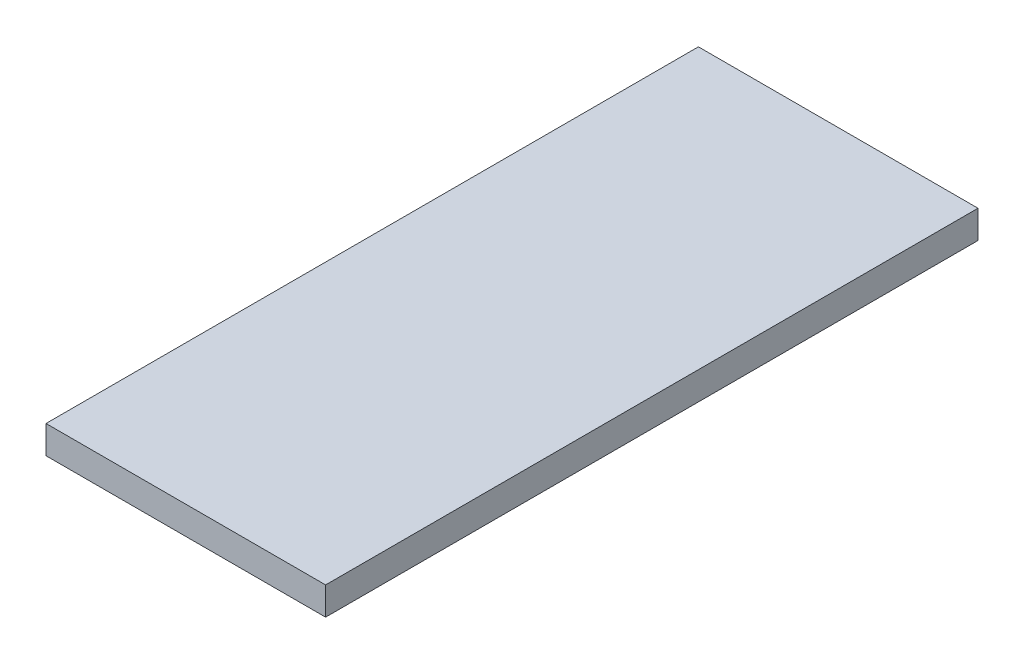
ISO-10303-21;
HEADER;
FILE_DESCRIPTION(('STEP AP214'),'2;1');
FILE_NAME('part.step','',(''),(''),'','','');
FILE_SCHEMA(('AUTOMOTIVE_DESIGN { 1 0 10303 214 1 1 1 1 }'));
ENDSEC;
DATA;
#1=APPLICATION_CONTEXT('core data for automotive mechanical design processes');
#2=APPLICATION_PROTOCOL_DEFINITION('international standard','automotive_design',2000,#1);
#3=PRODUCT_CONTEXT('',#1,'mechanical');
#4=PRODUCT('Part','Part','',(#3));
#5=PRODUCT_RELATED_PRODUCT_CATEGORY('part','',(#4));
#6=PRODUCT_DEFINITION_FORMATION('','',#4);
#7=PRODUCT_DEFINITION_CONTEXT('part definition',#1,'design');
#8=PRODUCT_DEFINITION('design','',#6,#7);
#9=PRODUCT_DEFINITION_SHAPE('','',#8);
#10=(LENGTH_UNIT() NAMED_UNIT(*) SI_UNIT(.MILLI.,.METRE.));
#11=(NAMED_UNIT(*) PLANE_ANGLE_UNIT() SI_UNIT($,.RADIAN.));
#12=(NAMED_UNIT(*) SI_UNIT($,.STERADIAN.) SOLID_ANGLE_UNIT());
#13=UNCERTAINTY_MEASURE_WITH_UNIT(LENGTH_MEASURE(1.E-05),#10,'distance_accuracy_value','');
#14=(GEOMETRIC_REPRESENTATION_CONTEXT(3) GLOBAL_UNCERTAINTY_ASSIGNED_CONTEXT((#13)) GLOBAL_UNIT_ASSIGNED_CONTEXT((#10,
#11,#12)) REPRESENTATION_CONTEXT('',''));
#15=CARTESIAN_POINT('',(0.,0.,0.));
#16=DIRECTION('',(0.,0.,1.));
#17=DIRECTION('',(1.,0.,0.));
#18=AXIS2_PLACEMENT_3D('',#15,#16,#17);
#19=CARTESIAN_POINT('',(-15.,3.,35.));
#20=DIRECTION('',(1.,0.,0.));
#21=DIRECTION('',(0.,0.,-1.));
#22=AXIS2_PLACEMENT_3D('',#19,#20,#21);
#23=PLANE('',#22);
#24=DIRECTION('',(0.,0.,1.));
#25=VECTOR('',#24,1.);
#26=CARTESIAN_POINT('',(-15.,0.,35.));
#27=LINE('',#26,#25);
#28=CARTESIAN_POINT('',(-15.,0.,-35.));
#29=VERTEX_POINT('',#28);
#30=CARTESIAN_POINT('',(-15.,0.,35.));
#31=VERTEX_POINT('',#30);
#32=EDGE_CURVE('E102',#29,#31,#27,.T.);
#33=ORIENTED_EDGE('',*,*,#32,.T.);
#34=DIRECTION('',(0.,-1.,0.));
#35=VECTOR('',#34,1.);
#36=CARTESIAN_POINT('',(-15.,3.,35.));
#37=LINE('',#36,#35);
#38=CARTESIAN_POINT('',(-15.,3.,35.));
#39=VERTEX_POINT('',#38);
#40=EDGE_CURVE('E11',#39,#31,#37,.T.);
#41=ORIENTED_EDGE('',*,*,#40,.F.);
#42=DIRECTION('',(0.,0.,1.));
#43=VECTOR('',#42,1.);
#44=CARTESIAN_POINT('',(-15.,3.,35.));
#45=LINE('',#44,#43);
#46=CARTESIAN_POINT('',(-15.,3.,-35.));
#47=VERTEX_POINT('',#46);
#48=EDGE_CURVE('E90',#47,#39,#45,.T.);
#49=ORIENTED_EDGE('',*,*,#48,.F.);
#50=DIRECTION('',(0.,-1.,0.));
#51=VECTOR('',#50,1.);
#52=CARTESIAN_POINT('',(-15.,3.,-35.));
#53=LINE('',#52,#51);
#54=EDGE_CURVE('E98',#47,#29,#53,.T.);
#55=ORIENTED_EDGE('',*,*,#54,.T.);
#56=EDGE_LOOP('',(#33,#41,#49,#55));
#57=FACE_BOUND('',#56,.T.);
#58=ADVANCED_FACE('F39',(#57),#23,.F.);
#59=CARTESIAN_POINT('',(15.,3.,35.));
#60=DIRECTION('',(0.,0.,-1.));
#61=DIRECTION('',(-1.,0.,0.));
#62=AXIS2_PLACEMENT_3D('',#59,#60,#61);
#63=PLANE('',#62);
#64=DIRECTION('',(1.,0.,0.));
#65=VECTOR('',#64,1.);
#66=CARTESIAN_POINT('',(15.,0.,35.));
#67=LINE('',#66,#65);
#68=CARTESIAN_POINT('',(15.,0.,35.));
#69=VERTEX_POINT('',#68);
#70=EDGE_CURVE('E94',#31,#69,#67,.T.);
#71=ORIENTED_EDGE('',*,*,#70,.T.);
#72=DIRECTION('',(0.,-1.,0.));
#73=VECTOR('',#72,1.);
#74=CARTESIAN_POINT('',(15.,3.,35.));
#75=LINE('',#74,#73);
#76=CARTESIAN_POINT('',(15.,3.,35.));
#77=VERTEX_POINT('',#76);
#78=EDGE_CURVE('E47',#77,#69,#75,.T.);
#79=ORIENTED_EDGE('',*,*,#78,.F.);
#80=DIRECTION('',(1.,0.,0.));
#81=VECTOR('',#80,1.);
#82=CARTESIAN_POINT('',(15.,3.,35.));
#83=LINE('',#82,#81);
#84=EDGE_CURVE('E85',#39,#77,#83,.T.);
#85=ORIENTED_EDGE('',*,*,#84,.F.);
#86=ORIENTED_EDGE('',*,*,#40,.T.);
#87=EDGE_LOOP('',(#71,#79,#85,#86));
#88=FACE_BOUND('',#87,.T.);
#89=ADVANCED_FACE('F93',(#88),#63,.F.);
#90=CARTESIAN_POINT('',(15.,3.,35.));
#91=DIRECTION('',(-1.,0.,0.));
#92=DIRECTION('',(0.,0.,1.));
#93=AXIS2_PLACEMENT_3D('',#90,#91,#92);
#94=PLANE('',#93);
#95=DIRECTION('',(0.,0.,-1.));
#96=VECTOR('',#95,1.);
#97=CARTESIAN_POINT('',(15.,0.,35.));
#98=LINE('',#97,#96);
#99=CARTESIAN_POINT('',(15.,0.,-35.));
#100=VERTEX_POINT('',#99);
#101=EDGE_CURVE('E72',#69,#100,#98,.T.);
#102=ORIENTED_EDGE('',*,*,#101,.T.);
#103=DIRECTION('',(0.,-1.,0.));
#104=VECTOR('',#103,1.);
#105=CARTESIAN_POINT('',(15.,3.,-35.));
#106=LINE('',#105,#104);
#107=CARTESIAN_POINT('',(15.,3.,-35.));
#108=VERTEX_POINT('',#107);
#109=EDGE_CURVE('E95',#108,#100,#106,.T.);
#110=ORIENTED_EDGE('',*,*,#109,.F.);
#111=DIRECTION('',(0.,0.,-1.));
#112=VECTOR('',#111,1.);
#113=CARTESIAN_POINT('',(15.,3.,35.));
#114=LINE('',#113,#112);
#115=EDGE_CURVE('E88',#77,#108,#114,.T.);
#116=ORIENTED_EDGE('',*,*,#115,.F.);
#117=ORIENTED_EDGE('',*,*,#78,.T.);
#118=EDGE_LOOP('',(#102,#110,#116,#117));
#119=FACE_BOUND('',#118,.T.);
#120=ADVANCED_FACE('F96',(#119),#94,.F.);
#121=CARTESIAN_POINT('',(15.,3.,-35.));
#122=DIRECTION('',(0.,0.,1.));
#123=DIRECTION('',(1.,0.,0.));
#124=AXIS2_PLACEMENT_3D('',#121,#122,#123);
#125=PLANE('',#124);
#126=DIRECTION('',(-1.,0.,0.));
#127=VECTOR('',#126,1.);
#128=CARTESIAN_POINT('',(15.,0.,-35.));
#129=LINE('',#128,#127);
#130=EDGE_CURVE('E78',#100,#29,#129,.T.);
#131=ORIENTED_EDGE('',*,*,#130,.T.);
#132=ORIENTED_EDGE('',*,*,#54,.F.);
#133=DIRECTION('',(-1.,0.,0.));
#134=VECTOR('',#133,1.);
#135=CARTESIAN_POINT('',(15.,3.,-35.));
#136=LINE('',#135,#134);
#137=EDGE_CURVE('E55',#108,#47,#136,.T.);
#138=ORIENTED_EDGE('',*,*,#137,.F.);
#139=ORIENTED_EDGE('',*,*,#109,.T.);
#140=EDGE_LOOP('',(#131,#132,#138,#139));
#141=FACE_BOUND('',#140,.T.);
#142=ADVANCED_FACE('F109',(#141),#125,.F.);
#143=CARTESIAN_POINT('',(0.,3.,0.));
#144=DIRECTION('',(0.,1.,0.));
#145=DIRECTION('',(0.,0.,1.));
#146=AXIS2_PLACEMENT_3D('',#143,#144,#145);
#147=PLANE('',#146);
#148=ORIENTED_EDGE('',*,*,#48,.T.);
#149=ORIENTED_EDGE('',*,*,#84,.T.);
#150=ORIENTED_EDGE('',*,*,#115,.T.);
#151=ORIENTED_EDGE('',*,*,#137,.T.);
#152=EDGE_LOOP('',(#148,#149,#150,#151));
#153=FACE_BOUND('',#152,.T.);
#154=ADVANCED_FACE('F86',(#153),#147,.T.);
#155=CARTESIAN_POINT('',(0.,0.,0.));
#156=DIRECTION('',(0.,1.,0.));
#157=DIRECTION('',(0.,0.,1.));
#158=AXIS2_PLACEMENT_3D('',#155,#156,#157);
#159=PLANE('',#158);
#160=ORIENTED_EDGE('',*,*,#32,.F.);
#161=ORIENTED_EDGE('',*,*,#130,.F.);
#162=ORIENTED_EDGE('',*,*,#101,.F.);
#163=ORIENTED_EDGE('',*,*,#70,.F.);
#164=EDGE_LOOP('',(#160,#161,#162,#163));
#165=FACE_BOUND('',#164,.T.);
#166=ADVANCED_FACE('F112',(#165),#159,.F.);
#167=CLOSED_SHELL('',(#58,#89,#120,#142,#154,#166));
#168=MANIFOLD_SOLID_BREP('B2',#167);
#169=ADVANCED_BREP_SHAPE_REPRESENTATION('',(#18,#168),#14);
#170=SHAPE_DEFINITION_REPRESENTATION(#9,#169);
ENDSEC;
END-ISO-10303-21;
